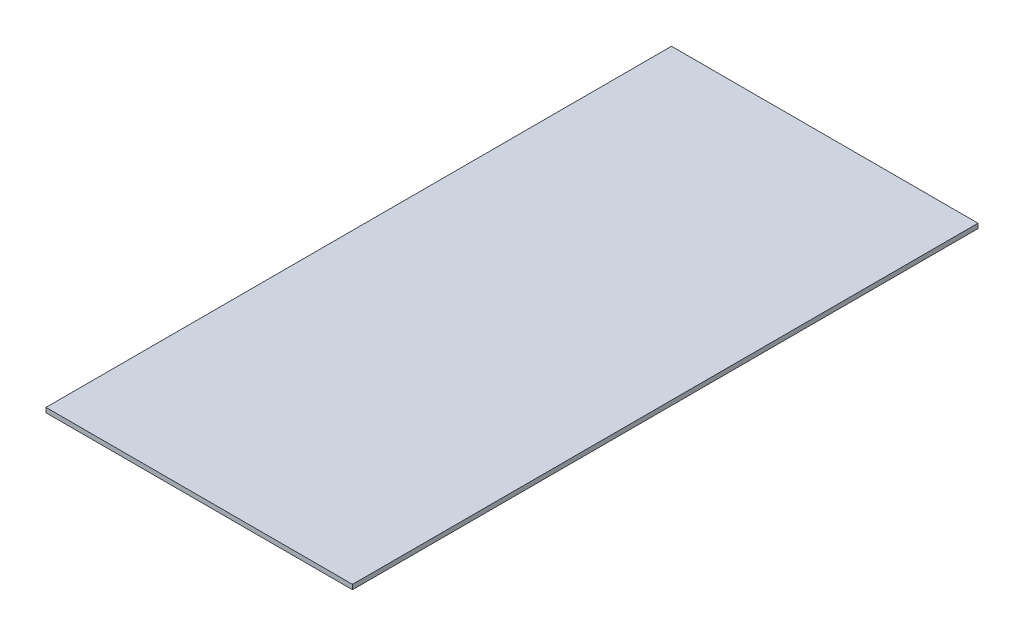
ISO-10303-21;
HEADER;
FILE_DESCRIPTION(('STEP AP214'),'2;1');
FILE_NAME('part.step','',(''),(''),'','','');
FILE_SCHEMA(('AUTOMOTIVE_DESIGN { 1 0 10303 214 1 1 1 1 }'));
ENDSEC;
DATA;
#1=APPLICATION_CONTEXT('core data for automotive mechanical design processes');
#2=APPLICATION_PROTOCOL_DEFINITION('international standard','automotive_design',2000,#1);
#3=PRODUCT_CONTEXT('',#1,'mechanical');
#4=PRODUCT('Part','Part','',(#3));
#5=PRODUCT_RELATED_PRODUCT_CATEGORY('part','',(#4));
#6=PRODUCT_DEFINITION_FORMATION('','',#4);
#7=PRODUCT_DEFINITION_CONTEXT('part definition',#1,'design');
#8=PRODUCT_DEFINITION('design','',#6,#7);
#9=PRODUCT_DEFINITION_SHAPE('','',#8);
#10=(LENGTH_UNIT() NAMED_UNIT(*) SI_UNIT(.MILLI.,.METRE.));
#11=(NAMED_UNIT(*) PLANE_ANGLE_UNIT() SI_UNIT($,.RADIAN.));
#12=(NAMED_UNIT(*) SI_UNIT($,.STERADIAN.) SOLID_ANGLE_UNIT());
#13=UNCERTAINTY_MEASURE_WITH_UNIT(LENGTH_MEASURE(1.E-05),#10,'distance_accuracy_value','');
#14=(GEOMETRIC_REPRESENTATION_CONTEXT(3) GLOBAL_UNCERTAINTY_ASSIGNED_CONTEXT((#13)) GLOBAL_UNIT_ASSIGNED_CONTEXT((#10,
#11,#12)) REPRESENTATION_CONTEXT('',''));
#15=CARTESIAN_POINT('',(0.,0.,0.));
#16=DIRECTION('',(0.,0.,1.));
#17=DIRECTION('',(1.,0.,0.));
#18=AXIS2_PLACEMENT_3D('',#15,#16,#17);
#19=CARTESIAN_POINT('',(0.,3.,0.));
#20=DIRECTION('',(1.,0.,0.));
#21=DIRECTION('',(0.,0.,-1.));
#22=AXIS2_PLACEMENT_3D('',#19,#20,#21);
#23=PLANE('',#22);
#24=DIRECTION('',(0.,0.,1.));
#25=VECTOR('',#24,1.);
#26=CARTESIAN_POINT('',(0.,0.,0.));
#27=LINE('',#26,#25);
#28=CARTESIAN_POINT('',(0.,0.,-400.));
#29=VERTEX_POINT('',#28);
#30=CARTESIAN_POINT('',(0.,0.,0.));
#31=VERTEX_POINT('',#30);
#32=EDGE_CURVE('E107',#29,#31,#27,.T.);
#33=ORIENTED_EDGE('',*,*,#32,.T.);
#34=DIRECTION('',(0.,-1.,0.));
#35=VECTOR('',#34,1.);
#36=CARTESIAN_POINT('',(0.,3.,0.));
#37=LINE('',#36,#35);
#38=CARTESIAN_POINT('',(0.,3.,0.));
#39=VERTEX_POINT('',#38);
#40=EDGE_CURVE('E11',#39,#31,#37,.T.);
#41=ORIENTED_EDGE('',*,*,#40,.F.);
#42=DIRECTION('',(0.,0.,1.));
#43=VECTOR('',#42,1.);
#44=CARTESIAN_POINT('',(0.,3.,0.));
#45=LINE('',#44,#43);
#46=CARTESIAN_POINT('',(0.,3.,-400.));
#47=VERTEX_POINT('',#46);
#48=EDGE_CURVE('E91',#47,#39,#45,.T.);
#49=ORIENTED_EDGE('',*,*,#48,.F.);
#50=DIRECTION('',(0.,-1.,0.));
#51=VECTOR('',#50,1.);
#52=CARTESIAN_POINT('',(0.,3.,-400.));
#53=LINE('',#52,#51);
#54=EDGE_CURVE('E103',#47,#29,#53,.T.);
#55=ORIENTED_EDGE('',*,*,#54,.T.);
#56=EDGE_LOOP('',(#33,#41,#49,#55));
#57=FACE_BOUND('',#56,.T.);
#58=ADVANCED_FACE('F39',(#57),#23,.F.);
#59=CARTESIAN_POINT('',(0.,3.,0.));
#60=DIRECTION('',(0.,0.,-1.));
#61=DIRECTION('',(-1.,0.,0.));
#62=AXIS2_PLACEMENT_3D('',#59,#60,#61);
#63=PLANE('',#62);
#64=DIRECTION('',(1.,0.,0.));
#65=VECTOR('',#64,1.);
#66=CARTESIAN_POINT('',(0.,0.,0.));
#67=LINE('',#66,#65);
#68=CARTESIAN_POINT('',(196.,0.,0.));
#69=VERTEX_POINT('',#68);
#70=EDGE_CURVE('E96',#31,#69,#67,.T.);
#71=ORIENTED_EDGE('',*,*,#70,.T.);
#72=DIRECTION('',(0.,-1.,0.));
#73=VECTOR('',#72,1.);
#74=CARTESIAN_POINT('',(196.,3.,0.));
#75=LINE('',#74,#73);
#76=CARTESIAN_POINT('',(196.,3.,0.));
#77=VERTEX_POINT('',#76);
#78=EDGE_CURVE('E48',#77,#69,#75,.T.);
#79=ORIENTED_EDGE('',*,*,#78,.F.);
#80=DIRECTION('',(1.,0.,0.));
#81=VECTOR('',#80,1.);
#82=CARTESIAN_POINT('',(0.,3.,0.));
#83=LINE('',#82,#81);
#84=EDGE_CURVE('E86',#39,#77,#83,.T.);
#85=ORIENTED_EDGE('',*,*,#84,.F.);
#86=ORIENTED_EDGE('',*,*,#40,.T.);
#87=EDGE_LOOP('',(#71,#79,#85,#86));
#88=FACE_BOUND('',#87,.T.);
#89=ADVANCED_FACE('F95',(#88),#63,.F.);
#90=CARTESIAN_POINT('',(196.,3.,0.));
#91=DIRECTION('',(-1.,0.,0.));
#92=DIRECTION('',(0.,0.,1.));
#93=AXIS2_PLACEMENT_3D('',#90,#91,#92);
#94=PLANE('',#93);
#95=DIRECTION('',(0.,0.,-1.));
#96=VECTOR('',#95,1.);
#97=CARTESIAN_POINT('',(196.,0.,0.));
#98=LINE('',#97,#96);
#99=CARTESIAN_POINT('',(196.,0.,-400.));
#100=VERTEX_POINT('',#99);
#101=EDGE_CURVE('E73',#69,#100,#98,.T.);
#102=ORIENTED_EDGE('',*,*,#101,.T.);
#103=DIRECTION('',(0.,-1.,0.));
#104=VECTOR('',#103,1.);
#105=CARTESIAN_POINT('',(196.,3.,-400.));
#106=LINE('',#105,#104);
#107=CARTESIAN_POINT('',(196.,3.,-400.));
#108=VERTEX_POINT('',#107);
#109=EDGE_CURVE('E98',#108,#100,#106,.T.);
#110=ORIENTED_EDGE('',*,*,#109,.F.);
#111=DIRECTION('',(0.,0.,-1.));
#112=VECTOR('',#111,1.);
#113=CARTESIAN_POINT('',(196.,3.,0.));
#114=LINE('',#113,#112);
#115=EDGE_CURVE('E89',#77,#108,#114,.T.);
#116=ORIENTED_EDGE('',*,*,#115,.F.);
#117=ORIENTED_EDGE('',*,*,#78,.T.);
#118=EDGE_LOOP('',(#102,#110,#116,#117));
#119=FACE_BOUND('',#118,.T.);
#120=ADVANCED_FACE('F99',(#119),#94,.F.);
#121=CARTESIAN_POINT('',(0.,3.,-400.));
#122=DIRECTION('',(0.,0.,1.));
#123=DIRECTION('',(1.,0.,0.));
#124=AXIS2_PLACEMENT_3D('',#121,#122,#123);
#125=PLANE('',#124);
#126=DIRECTION('',(-1.,0.,0.));
#127=VECTOR('',#126,1.);
#128=CARTESIAN_POINT('',(0.,0.,-400.));
#129=LINE('',#128,#127);
#130=EDGE_CURVE('E79',#100,#29,#129,.T.);
#131=ORIENTED_EDGE('',*,*,#130,.T.);
#132=ORIENTED_EDGE('',*,*,#54,.F.);
#133=DIRECTION('',(-1.,0.,0.));
#134=VECTOR('',#133,1.);
#135=CARTESIAN_POINT('',(0.,3.,-400.));
#136=LINE('',#135,#134);
#137=EDGE_CURVE('E56',#108,#47,#136,.T.);
#138=ORIENTED_EDGE('',*,*,#137,.F.);
#139=ORIENTED_EDGE('',*,*,#109,.T.);
#140=EDGE_LOOP('',(#131,#132,#138,#139));
#141=FACE_BOUND('',#140,.T.);
#142=ADVANCED_FACE('F120',(#141),#125,.F.);
#143=CARTESIAN_POINT('',(0.,3.,0.));
#144=DIRECTION('',(0.,-1.,0.));
#145=DIRECTION('',(0.,0.,-1.));
#146=AXIS2_PLACEMENT_3D('',#143,#144,#145);
#147=PLANE('',#146);
#148=ORIENTED_EDGE('',*,*,#48,.T.);
#149=ORIENTED_EDGE('',*,*,#84,.T.);
#150=ORIENTED_EDGE('',*,*,#115,.T.);
#151=ORIENTED_EDGE('',*,*,#137,.T.);
#152=EDGE_LOOP('',(#148,#149,#150,#151));
#153=FACE_BOUND('',#152,.T.);
#154=ADVANCED_FACE('F87',(#153),#147,.F.);
#155=CARTESIAN_POINT('',(0.,0.,0.));
#156=DIRECTION('',(0.,-1.,0.));
#157=DIRECTION('',(0.,0.,-1.));
#158=AXIS2_PLACEMENT_3D('',#155,#156,#157);
#159=PLANE('',#158);
#160=ORIENTED_EDGE('',*,*,#32,.F.);
#161=ORIENTED_EDGE('',*,*,#130,.F.);
#162=ORIENTED_EDGE('',*,*,#101,.F.);
#163=ORIENTED_EDGE('',*,*,#70,.F.);
#164=EDGE_LOOP('',(#160,#161,#162,#163));
#165=FACE_BOUND('',#164,.T.);
#166=ADVANCED_FACE('F123',(#165),#159,.T.);
#167=CLOSED_SHELL('',(#58,#89,#120,#142,#154,#166));
#168=MANIFOLD_SOLID_BREP('B2',#167);
#169=ADVANCED_BREP_SHAPE_REPRESENTATION('',(#18,#168),#14);
#170=SHAPE_DEFINITION_REPRESENTATION(#9,#169);
ENDSEC;
END-ISO-10303-21;
